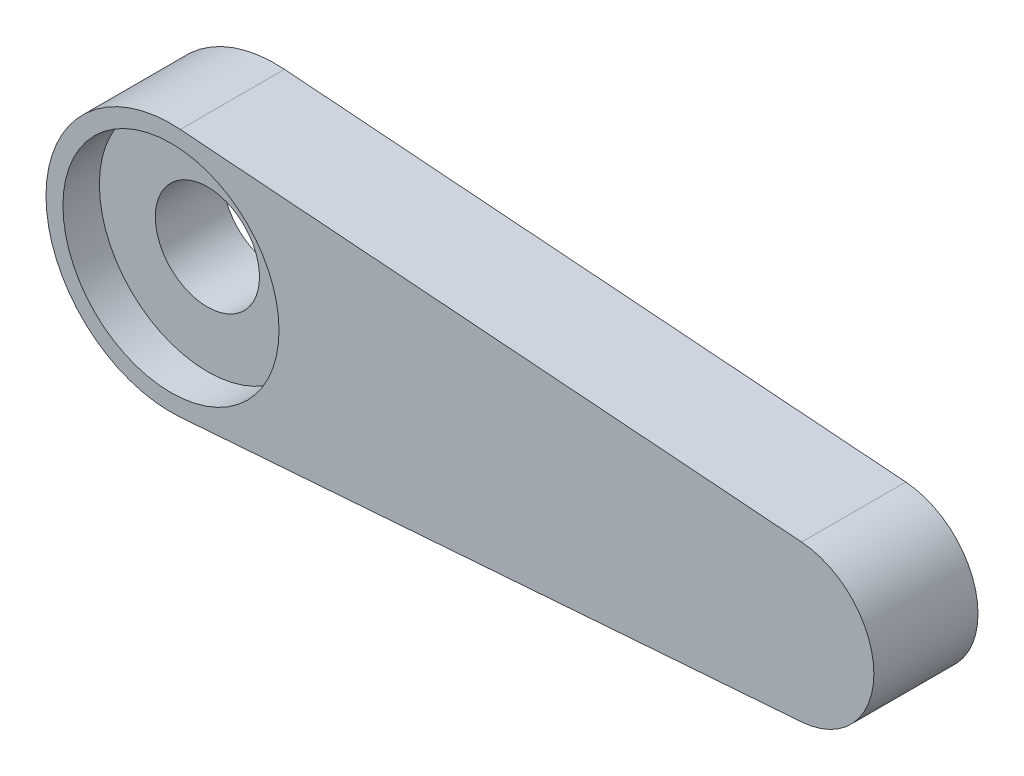
ISO-10303-21;
HEADER;
FILE_DESCRIPTION(('STEP AP214'),'2;1');
FILE_NAME('part.step','',(''),(''),'','','');
FILE_SCHEMA(('AUTOMOTIVE_DESIGN { 1 0 10303 214 1 1 1 1 }'));
ENDSEC;
DATA;
#1=APPLICATION_CONTEXT('core data for automotive mechanical design processes');
#2=APPLICATION_PROTOCOL_DEFINITION('international standard','automotive_design',2000,#1);
#3=PRODUCT_CONTEXT('',#1,'mechanical');
#4=PRODUCT('Part','Part','',(#3));
#5=PRODUCT_RELATED_PRODUCT_CATEGORY('part','',(#4));
#6=PRODUCT_DEFINITION_FORMATION('','',#4);
#7=PRODUCT_DEFINITION_CONTEXT('part definition',#1,'design');
#8=PRODUCT_DEFINITION('design','',#6,#7);
#9=PRODUCT_DEFINITION_SHAPE('','',#8);
#10=(LENGTH_UNIT() NAMED_UNIT(*) SI_UNIT(.MILLI.,.METRE.));
#11=(NAMED_UNIT(*) PLANE_ANGLE_UNIT() SI_UNIT($,.RADIAN.));
#12=(NAMED_UNIT(*) SI_UNIT($,.STERADIAN.) SOLID_ANGLE_UNIT());
#13=UNCERTAINTY_MEASURE_WITH_UNIT(LENGTH_MEASURE(1.E-05),#10,'distance_accuracy_value','');
#14=(GEOMETRIC_REPRESENTATION_CONTEXT(3) GLOBAL_UNCERTAINTY_ASSIGNED_CONTEXT((#13)) GLOBAL_UNIT_ASSIGNED_CONTEXT((#10,
#11,#12)) REPRESENTATION_CONTEXT('',''));
#15=CARTESIAN_POINT('',(0.,0.,0.));
#16=DIRECTION('',(0.,0.,1.));
#17=DIRECTION('',(1.,0.,0.));
#18=AXIS2_PLACEMENT_3D('',#15,#16,#17);
#19=CARTESIAN_POINT('',(0.9,-11.9662024051075,10.));
#20=DIRECTION('',(-0.075,0.997183533758957,0.));
#21=DIRECTION('',(-0.997183533758957,-0.075,0.));
#22=AXIS2_PLACEMENT_3D('',#19,#20,#21);
#23=PLANE('',#22);
#24=DIRECTION('',(0.997183533758957,0.075,0.));
#25=VECTOR('',#24,1.);
#26=CARTESIAN_POINT('',(0.9,-11.9662024051075,0.));
#27=LINE('',#26,#25);
#28=CARTESIAN_POINT('',(0.9,-11.9662024051075,0.));
#29=VERTEX_POINT('',#28);
#30=CARTESIAN_POINT('',(60.5625,-7.47887650319218,0.));
#31=VERTEX_POINT('',#30);
#32=EDGE_CURVE('E108',#29,#31,#27,.T.);
#33=ORIENTED_EDGE('',*,*,#32,.T.);
#34=DIRECTION('',(0.,0.,-1.));
#35=VECTOR('',#34,1.);
#36=CARTESIAN_POINT('',(60.5625,-7.47887650319218,10.));
#37=LINE('',#36,#35);
#38=CARTESIAN_POINT('',(60.5625,-7.47887650319218,10.));
#39=VERTEX_POINT('',#38);
#40=EDGE_CURVE('E11',#39,#31,#37,.T.);
#41=ORIENTED_EDGE('',*,*,#40,.F.);
#42=DIRECTION('',(0.997183533758957,0.075,0.));
#43=VECTOR('',#42,1.);
#44=CARTESIAN_POINT('',(0.9,-11.9662024051075,10.));
#45=LINE('',#44,#43);
#46=CARTESIAN_POINT('',(0.9,-11.9662024051075,10.));
#47=VERTEX_POINT('',#46);
#48=EDGE_CURVE('E80',#47,#39,#45,.T.);
#49=ORIENTED_EDGE('',*,*,#48,.F.);
#50=DIRECTION('',(0.,0.,-1.));
#51=VECTOR('',#50,1.);
#52=CARTESIAN_POINT('',(0.9,-11.9662024051075,10.));
#53=LINE('',#52,#51);
#54=EDGE_CURVE('E56',#47,#29,#53,.T.);
#55=ORIENTED_EDGE('',*,*,#54,.T.);
#56=EDGE_LOOP('',(#33,#41,#49,#55));
#57=FACE_BOUND('',#56,.T.);
#58=ADVANCED_FACE('F38',(#57),#23,.F.);
#59=CARTESIAN_POINT('',(60.,0.,10.));
#60=DIRECTION('',(0.,0.,-1.));
#61=DIRECTION('',(-1.,0.,0.));
#62=AXIS2_PLACEMENT_3D('',#59,#60,#61);
#63=CYLINDRICAL_SURFACE('',#62,7.5);
#64=CARTESIAN_POINT('',(60.,0.,0.));
#65=DIRECTION('',(0.,0.,-1.));
#66=DIRECTION('',(-1.,0.,0.));
#67=AXIS2_PLACEMENT_3D('',#64,#65,#66);
#68=CIRCLE('',#67,7.5);
#69=CARTESIAN_POINT('',(60.5625,7.47887650319218,0.));
#70=VERTEX_POINT('',#69);
#71=EDGE_CURVE('E89',#70,#31,#68,.T.);
#72=ORIENTED_EDGE('',*,*,#71,.F.);
#73=DIRECTION('',(0.,0.,-1.));
#74=VECTOR('',#73,1.);
#75=CARTESIAN_POINT('',(60.5625,7.47887650319218,10.));
#76=LINE('',#75,#74);
#77=CARTESIAN_POINT('',(60.5625,7.47887650319218,10.));
#78=VERTEX_POINT('',#77);
#79=EDGE_CURVE('E48',#78,#70,#76,.T.);
#80=ORIENTED_EDGE('',*,*,#79,.F.);
#81=CARTESIAN_POINT('',(60.,0.,10.));
#82=DIRECTION('',(0.,0.,-1.));
#83=DIRECTION('',(-1.,0.,0.));
#84=AXIS2_PLACEMENT_3D('',#81,#82,#83);
#85=CIRCLE('',#84,7.5);
#86=EDGE_CURVE('E87',#78,#39,#85,.T.);
#87=ORIENTED_EDGE('',*,*,#86,.T.);
#88=ORIENTED_EDGE('',*,*,#40,.T.);
#89=EDGE_LOOP('',(#72,#80,#87,#88));
#90=FACE_BOUND('',#89,.T.);
#91=ADVANCED_FACE('F86',(#90),#63,.T.);
#92=CARTESIAN_POINT('',(0.900000000000001,11.9662024051075,10.));
#93=DIRECTION('',(0.0750000000000001,0.997183533758957,0.));
#94=DIRECTION('',(-0.997183533758957,0.0750000000000001,0.));
#95=AXIS2_PLACEMENT_3D('',#92,#93,#94);
#96=PLANE('',#95);
#97=DIRECTION('',(0.997183533758957,-0.0750000000000001,0.));
#98=VECTOR('',#97,1.);
#99=CARTESIAN_POINT('',(0.900000000000001,11.9662024051075,0.));
#100=LINE('',#99,#98);
#101=CARTESIAN_POINT('',(0.899999999999998,11.9662024051075,0.));
#102=VERTEX_POINT('',#101);
#103=EDGE_CURVE('E114',#102,#70,#100,.T.);
#104=ORIENTED_EDGE('',*,*,#103,.F.);
#105=DIRECTION('',(0.,0.,-1.));
#106=VECTOR('',#105,1.);
#107=CARTESIAN_POINT('',(0.899999999999998,11.9662024051075,10.));
#108=LINE('',#107,#106);
#109=CARTESIAN_POINT('',(0.899999999999998,11.9662024051075,10.));
#110=VERTEX_POINT('',#109);
#111=EDGE_CURVE('E69',#110,#102,#108,.T.);
#112=ORIENTED_EDGE('',*,*,#111,.F.);
#113=DIRECTION('',(0.997183533758957,-0.0750000000000001,0.));
#114=VECTOR('',#113,1.);
#115=CARTESIAN_POINT('',(0.900000000000001,11.9662024051075,10.));
#116=LINE('',#115,#114);
#117=EDGE_CURVE('E97',#110,#78,#116,.T.);
#118=ORIENTED_EDGE('',*,*,#117,.T.);
#119=ORIENTED_EDGE('',*,*,#79,.T.);
#120=EDGE_LOOP('',(#104,#112,#118,#119));
#121=FACE_BOUND('',#120,.T.);
#122=ADVANCED_FACE('F100',(#121),#96,.T.);
#123=CARTESIAN_POINT('',(0.,0.,10.));
#124=DIRECTION('',(0.,0.,-1.));
#125=DIRECTION('',(-1.,0.,0.));
#126=AXIS2_PLACEMENT_3D('',#123,#124,#125);
#127=CYLINDRICAL_SURFACE('',#126,12.);
#128=CARTESIAN_POINT('',(0.,0.,0.));
#129=DIRECTION('',(0.,0.,-1.));
#130=DIRECTION('',(-1.,0.,0.));
#131=AXIS2_PLACEMENT_3D('',#128,#129,#130);
#132=CIRCLE('',#131,12.);
#133=EDGE_CURVE('E117',#29,#102,#132,.T.);
#134=ORIENTED_EDGE('',*,*,#133,.F.);
#135=ORIENTED_EDGE('',*,*,#54,.F.);
#136=CARTESIAN_POINT('',(0.,0.,10.));
#137=DIRECTION('',(0.,0.,-1.));
#138=DIRECTION('',(-1.,0.,0.));
#139=AXIS2_PLACEMENT_3D('',#136,#137,#138);
#140=CIRCLE('',#139,12.);
#141=EDGE_CURVE('E102',#47,#110,#140,.T.);
#142=ORIENTED_EDGE('',*,*,#141,.T.);
#143=ORIENTED_EDGE('',*,*,#111,.T.);
#144=EDGE_LOOP('',(#134,#135,#142,#143));
#145=FACE_BOUND('',#144,.T.);
#146=ADVANCED_FACE('F159',(#145),#127,.T.);
#147=CARTESIAN_POINT('',(60.,0.,10.));
#148=DIRECTION('',(0.,0.,-1.));
#149=DIRECTION('',(-1.,0.,0.));
#150=AXIS2_PLACEMENT_3D('',#147,#148,#149);
#151=PLANE('',#150);
#152=CARTESIAN_POINT('',(0.,0.,10.));
#153=DIRECTION('',(0.,0.,1.));
#154=DIRECTION('',(1.,0.,0.));
#155=AXIS2_PLACEMENT_3D('',#152,#153,#154);
#156=CIRCLE('',#155,10.375);
#157=CARTESIAN_POINT('',(10.375,0.,10.));
#158=VERTEX_POINT('',#157);
#159=EDGE_CURVE('E127',#158,#158,#156,.T.);
#160=ORIENTED_EDGE('',*,*,#159,.F.);
#161=EDGE_LOOP('',(#160));
#162=FACE_BOUND('',#161,.T.);
#163=ORIENTED_EDGE('',*,*,#48,.T.);
#164=ORIENTED_EDGE('',*,*,#86,.F.);
#165=ORIENTED_EDGE('',*,*,#117,.F.);
#166=ORIENTED_EDGE('',*,*,#141,.F.);
#167=EDGE_LOOP('',(#163,#164,#165,#166));
#168=FACE_BOUND('',#167,.T.);
#169=ADVANCED_FACE('F96',(#162,#168),#151,.F.);
#170=CARTESIAN_POINT('',(60.,0.,0.));
#171=DIRECTION('',(0.,0.,-1.));
#172=DIRECTION('',(-1.,0.,0.));
#173=AXIS2_PLACEMENT_3D('',#170,#171,#172);
#174=PLANE('',#173);
#175=CARTESIAN_POINT('',(0.,0.,0.));
#176=DIRECTION('',(0.,0.,-1.));
#177=DIRECTION('',(-1.,0.,0.));
#178=AXIS2_PLACEMENT_3D('',#175,#176,#177);
#179=CIRCLE('',#178,5.);
#180=CARTESIAN_POINT('',(-5.,0.,0.));
#181=VERTEX_POINT('',#180);
#182=EDGE_CURVE('E134',#181,#181,#179,.T.);
#183=ORIENTED_EDGE('',*,*,#182,.F.);
#184=EDGE_LOOP('',(#183));
#185=FACE_BOUND('',#184,.T.);
#186=ORIENTED_EDGE('',*,*,#32,.F.);
#187=ORIENTED_EDGE('',*,*,#133,.T.);
#188=ORIENTED_EDGE('',*,*,#103,.T.);
#189=ORIENTED_EDGE('',*,*,#71,.T.);
#190=EDGE_LOOP('',(#186,#187,#188,#189));
#191=FACE_BOUND('',#190,.T.);
#192=ADVANCED_FACE('F154',(#185,#191),#174,.T.);
#193=CARTESIAN_POINT('',(0.,0.,6.5));
#194=DIRECTION('',(0.,0.,1.));
#195=DIRECTION('',(1.,0.,0.));
#196=AXIS2_PLACEMENT_3D('',#193,#194,#195);
#197=CYLINDRICAL_SURFACE('',#196,10.375);
#198=CARTESIAN_POINT('',(0.,0.,6.5));
#199=DIRECTION('',(0.,0.,1.));
#200=DIRECTION('',(1.,0.,0.));
#201=AXIS2_PLACEMENT_3D('',#198,#199,#200);
#202=CIRCLE('',#201,10.375);
#203=CARTESIAN_POINT('',(10.375,0.,6.5));
#204=VERTEX_POINT('',#203);
#205=EDGE_CURVE('E111',#204,#204,#202,.T.);
#206=ORIENTED_EDGE('',*,*,#205,.F.);
#207=EDGE_LOOP('',(#206));
#208=FACE_BOUND('',#207,.T.);
#209=ORIENTED_EDGE('',*,*,#159,.T.);
#210=EDGE_LOOP('',(#209));
#211=FACE_BOUND('',#210,.T.);
#212=ADVANCED_FACE('F148',(#208,#211),#197,.F.);
#213=CARTESIAN_POINT('',(0.,0.,6.5));
#214=DIRECTION('',(0.,0.,1.));
#215=DIRECTION('',(1.,0.,0.));
#216=AXIS2_PLACEMENT_3D('',#213,#214,#215);
#217=PLANE('',#216);
#218=CARTESIAN_POINT('',(0.,0.,6.5));
#219=DIRECTION('',(0.,0.,1.));
#220=DIRECTION('',(1.,0.,0.));
#221=AXIS2_PLACEMENT_3D('',#218,#219,#220);
#222=CIRCLE('',#221,5.);
#223=CARTESIAN_POINT('',(5.,0.,6.5));
#224=VERTEX_POINT('',#223);
#225=EDGE_CURVE('E41',#224,#224,#222,.T.);
#226=ORIENTED_EDGE('',*,*,#225,.F.);
#227=EDGE_LOOP('',(#226));
#228=FACE_BOUND('',#227,.T.);
#229=ORIENTED_EDGE('',*,*,#205,.T.);
#230=EDGE_LOOP('',(#229));
#231=FACE_BOUND('',#230,.T.);
#232=ADVANCED_FACE('F145',(#228,#231),#217,.T.);
#233=CARTESIAN_POINT('',(0.,0.,10.));
#234=DIRECTION('',(0.,0.,-1.));
#235=DIRECTION('',(-1.,0.,0.));
#236=AXIS2_PLACEMENT_3D('',#233,#234,#235);
#237=CYLINDRICAL_SURFACE('',#236,5.);
#238=ORIENTED_EDGE('',*,*,#225,.T.);
#239=EDGE_LOOP('',(#238));
#240=FACE_BOUND('',#239,.T.);
#241=ORIENTED_EDGE('',*,*,#182,.T.);
#242=EDGE_LOOP('',(#241));
#243=FACE_BOUND('',#242,.T.);
#244=ADVANCED_FACE('F143',(#240,#243),#237,.F.);
#245=CLOSED_SHELL('',(#58,#91,#122,#146,#169,#192,#212,#232,#244));
#246=MANIFOLD_SOLID_BREP('B2',#245);
#247=ADVANCED_BREP_SHAPE_REPRESENTATION('',(#18,#246),#14);
#248=SHAPE_DEFINITION_REPRESENTATION(#9,#247);
ENDSEC;
END-ISO-10303-21;
